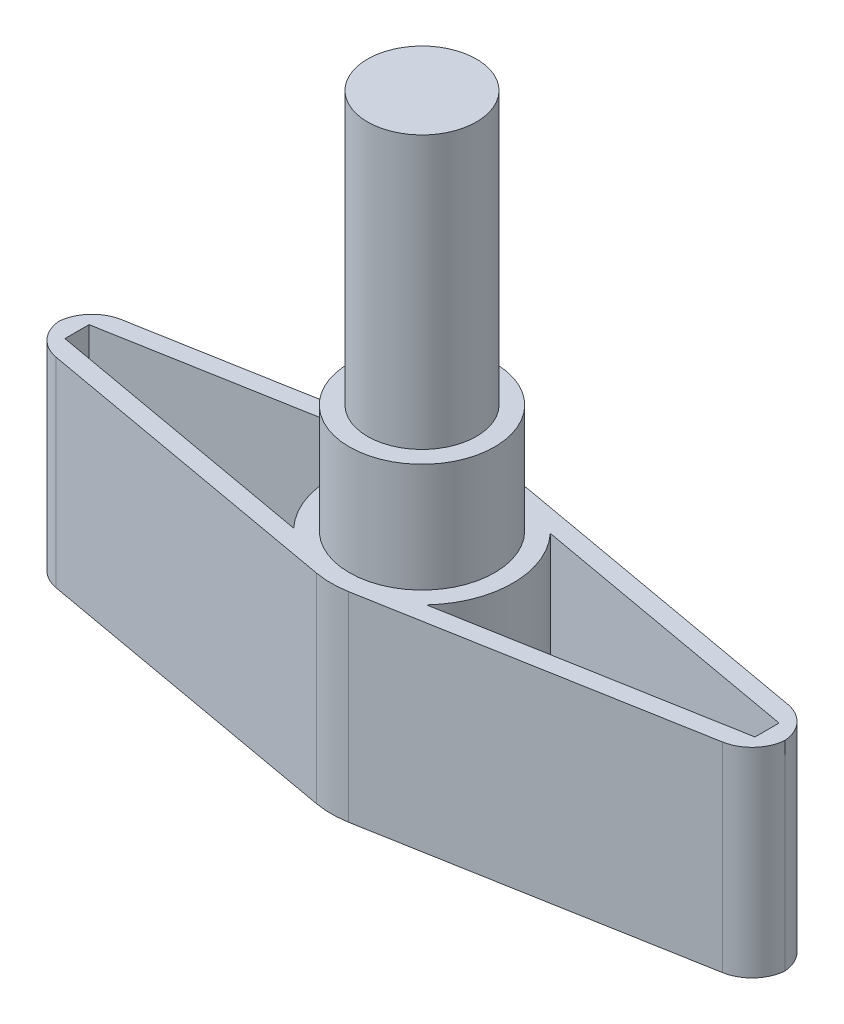
ISO-10303-21;
HEADER;
FILE_DESCRIPTION(('STEP AP214'),'2;1');
FILE_NAME('part.step','',(''),(''),'','','');
FILE_SCHEMA(('AUTOMOTIVE_DESIGN { 1 0 10303 214 1 1 1 1 }'));
ENDSEC;
DATA;
#1=APPLICATION_CONTEXT('core data for automotive mechanical design processes');
#2=APPLICATION_PROTOCOL_DEFINITION('international standard','automotive_design',2000,#1);
#3=PRODUCT_CONTEXT('',#1,'mechanical');
#4=PRODUCT('Part','Part','',(#3));
#5=PRODUCT_RELATED_PRODUCT_CATEGORY('part','',(#4));
#6=PRODUCT_DEFINITION_FORMATION('','',#4);
#7=PRODUCT_DEFINITION_CONTEXT('part definition',#1,'design');
#8=PRODUCT_DEFINITION('design','',#6,#7);
#9=PRODUCT_DEFINITION_SHAPE('','',#8);
#10=(LENGTH_UNIT() NAMED_UNIT(*) SI_UNIT(.MILLI.,.METRE.));
#11=(NAMED_UNIT(*) PLANE_ANGLE_UNIT() SI_UNIT($,.RADIAN.));
#12=(NAMED_UNIT(*) SI_UNIT($,.STERADIAN.) SOLID_ANGLE_UNIT());
#13=UNCERTAINTY_MEASURE_WITH_UNIT(LENGTH_MEASURE(1.E-05),#10,'distance_accuracy_value','');
#14=(GEOMETRIC_REPRESENTATION_CONTEXT(3) GLOBAL_UNCERTAINTY_ASSIGNED_CONTEXT((#13)) GLOBAL_UNIT_ASSIGNED_CONTEXT((#10,
#11,#12)) REPRESENTATION_CONTEXT('',''));
#15=CARTESIAN_POINT('',(0.,0.,0.));
#16=DIRECTION('',(0.,0.,1.));
#17=DIRECTION('',(1.,0.,0.));
#18=AXIS2_PLACEMENT_3D('',#15,#16,#17);
#19=CARTESIAN_POINT('',(0.,9.99999999999999,0.));
#20=DIRECTION('',(0.,1.,0.));
#21=DIRECTION('',(0.,0.,1.));
#22=AXIS2_PLACEMENT_3D('',#19,#20,#21);
#23=PLANE('',#22);
#24=CARTESIAN_POINT('',(0.,9.99999999999999,0.));
#25=DIRECTION('',(0.,1.,0.));
#26=DIRECTION('',(0.,0.,1.));
#27=AXIS2_PLACEMENT_3D('',#24,#25,#26);
#28=CIRCLE('',#27,4.);
#29=CARTESIAN_POINT('',(0.,9.99999999999999,4.));
#30=VERTEX_POINT('',#29);
#31=EDGE_CURVE('E322',#30,#30,#28,.T.);
#32=ORIENTED_EDGE('',*,*,#31,.F.);
#33=EDGE_LOOP('',(#32));
#34=FACE_BOUND('',#33,.T.);
#35=DIRECTION('',(0.984367303622125,0.,-0.176127827329209));
#36=VECTOR('',#35,1.);
#37=CARTESIAN_POINT('',(20.0001571937306,9.99999999999999,1.50087854583264));
#38=LINE('',#37,#36);
#39=CARTESIAN_POINT('',(0.880639136645989,9.99999999999999,4.92183651811062));
#40=VERTEX_POINT('',#39);
#41=CARTESIAN_POINT('',(18.3524128483891,10.,1.79570104803392));
#42=VERTEX_POINT('',#41);
#43=EDGE_CURVE('E283',#40,#42,#38,.T.);
#44=ORIENTED_EDGE('',*,*,#43,.T.);
#45=CARTESIAN_POINT('',(18.0001571937307,10.,-0.173033559210334));
#46=DIRECTION('',(0.,1.,0.));
#47=DIRECTION('',(0.,0.,1.));
#48=AXIS2_PLACEMENT_3D('',#45,#46,#47);
#49=CIRCLE('',#48,2.);
#50=CARTESIAN_POINT('',(19.9926579810295,10.,0.));
#51=VERTEX_POINT('',#50);
#52=EDGE_CURVE('E71',#42,#51,#49,.T.);
#53=ORIENTED_EDGE('',*,*,#52,.T.);
#54=CARTESIAN_POINT('',(18.0001571937306,10.,0.173033559210334));
#55=DIRECTION('',(0.,1.,0.));
#56=DIRECTION('',(0.,0.,1.));
#57=AXIS2_PLACEMENT_3D('',#54,#55,#56);
#58=CIRCLE('',#57,2.);
#59=CARTESIAN_POINT('',(18.3524128483891,10.,-1.79570104803389));
#60=VERTEX_POINT('',#59);
#61=EDGE_CURVE('E310',#51,#60,#58,.T.);
#62=ORIENTED_EDGE('',*,*,#61,.T.);
#63=DIRECTION('',(-0.984367303622125,0.,-0.17612782732921));
#64=VECTOR('',#63,1.);
#65=CARTESIAN_POINT('',(20.0001571937306,10.,-1.50087854583264));
#66=LINE('',#65,#64);
#67=CARTESIAN_POINT('',(0.880639136646044,9.99999999999999,-4.92183651811062));
#68=VERTEX_POINT('',#67);
#69=EDGE_CURVE('E285',#60,#68,#66,.T.);
#70=ORIENTED_EDGE('',*,*,#69,.T.);
#71=CARTESIAN_POINT('',(0.,9.99999999999999,0.));
#72=DIRECTION('',(0.,1.,0.));
#73=DIRECTION('',(0.,0.,1.));
#74=AXIS2_PLACEMENT_3D('',#71,#72,#73);
#75=CIRCLE('',#74,5.);
#76=CARTESIAN_POINT('',(-0.880639136646044,10.,-4.92183651811062));
#77=VERTEX_POINT('',#76);
#78=EDGE_CURVE('E287',#68,#77,#75,.T.);
#79=ORIENTED_EDGE('',*,*,#78,.T.);
#80=DIRECTION('',(-0.984367303622125,0.,0.17612782732921));
#81=VECTOR('',#80,1.);
#82=CARTESIAN_POINT('',(-20.0001571937307,10.,-1.50087854583261));
#83=LINE('',#82,#81);
#84=CARTESIAN_POINT('',(-18.3524128483891,9.99999999999999,-1.79570104803389));
#85=VERTEX_POINT('',#84);
#86=EDGE_CURVE('E197',#77,#85,#83,.T.);
#87=ORIENTED_EDGE('',*,*,#86,.T.);
#88=CARTESIAN_POINT('',(-18.0001571937307,10.,0.173033559210362));
#89=DIRECTION('',(0.,1.,0.));
#90=DIRECTION('',(0.,0.,1.));
#91=AXIS2_PLACEMENT_3D('',#88,#89,#90);
#92=CIRCLE('',#91,2.);
#93=CARTESIAN_POINT('',(-19.9926579810296,10.,0.));
#94=VERTEX_POINT('',#93);
#95=EDGE_CURVE('E78',#85,#94,#92,.T.);
#96=ORIENTED_EDGE('',*,*,#95,.T.);
#97=CARTESIAN_POINT('',(-18.0001571937307,9.99999999999999,-0.173033559210334));
#98=DIRECTION('',(0.,1.,0.));
#99=DIRECTION('',(0.,0.,1.));
#100=AXIS2_PLACEMENT_3D('',#97,#98,#99);
#101=CIRCLE('',#100,2.);
#102=CARTESIAN_POINT('',(-18.3524128483891,9.99999999999999,1.79570104803389));
#103=VERTEX_POINT('',#102);
#104=EDGE_CURVE('E307',#94,#103,#101,.T.);
#105=ORIENTED_EDGE('',*,*,#104,.T.);
#106=DIRECTION('',(0.984367303622125,0.,0.176127827329209));
#107=VECTOR('',#106,1.);
#108=CARTESIAN_POINT('',(-20.0001571937307,10.,1.50087854583264));
#109=LINE('',#108,#107);
#110=CARTESIAN_POINT('',(-0.8806391366461,9.99999999999999,4.92183651811062));
#111=VERTEX_POINT('',#110);
#112=EDGE_CURVE('E279',#103,#111,#109,.T.);
#113=ORIENTED_EDGE('',*,*,#112,.T.);
#114=CARTESIAN_POINT('',(0.,9.99999999999999,0.));
#115=DIRECTION('',(0.,1.,0.));
#116=DIRECTION('',(0.,0.,1.));
#117=AXIS2_PLACEMENT_3D('',#114,#115,#116);
#118=CIRCLE('',#117,5.);
#119=EDGE_CURVE('E281',#111,#40,#118,.T.);
#120=ORIENTED_EDGE('',*,*,#119,.T.);
#121=EDGE_LOOP('',(#44,#53,#62,#70,#79,#87,#96,#105,#113,#120));
#122=FACE_BOUND('',#121,.T.);
#123=CARTESIAN_POINT('',(0.,9.99999999999999,0.));
#124=DIRECTION('',(0.,-1.,0.));
#125=DIRECTION('',(0.,0.,1.));
#126=AXIS2_PLACEMENT_3D('',#123,#124,#125);
#127=CIRCLE('',#126,4.99999999999997);
#128=CARTESIAN_POINT('',(-3.65761322018321,10.,3.40908573250082));
#129=VERTEX_POINT('',#128);
#130=CARTESIAN_POINT('',(-3.65761322018321,10.,-3.40908573250087));
#131=VERTEX_POINT('',#130);
#132=EDGE_CURVE('E251',#129,#131,#127,.T.);
#133=ORIENTED_EDGE('',*,*,#132,.F.);
#134=DIRECTION('',(0.984367303622126,0.,0.176127827329204));
#135=VECTOR('',#134,1.);
#136=CARTESIAN_POINT('',(-18.8240293664014,9.99999999999999,0.695436148270612));
#137=LINE('',#136,#135);
#138=CARTESIAN_POINT('',(-19.0001571937305,9.99999999999998,0.663922493311153));
#139=VERTEX_POINT('',#138);
#140=EDGE_CURVE('E249',#139,#129,#137,.T.);
#141=ORIENTED_EDGE('',*,*,#140,.F.);
#142=DIRECTION('',(0.,0.,1.));
#143=VECTOR('',#142,1.);
#144=CARTESIAN_POINT('',(-19.0001571937305,9.99999999999998,0.663922493311153));
#145=LINE('',#144,#143);
#146=CARTESIAN_POINT('',(-19.0001571937307,10.,-0.663922493311125));
#147=VERTEX_POINT('',#146);
#148=EDGE_CURVE('E257',#147,#139,#145,.T.);
#149=ORIENTED_EDGE('',*,*,#148,.F.);
#150=DIRECTION('',(-0.984367303622125,0.,0.17612782732921));
#151=VECTOR('',#150,1.);
#152=CARTESIAN_POINT('',(-18.8240293664014,9.99999999999999,-0.695436148270584));
#153=LINE('',#152,#151);
#154=EDGE_CURVE('E254',#131,#147,#153,.T.);
#155=ORIENTED_EDGE('',*,*,#154,.F.);
#156=EDGE_LOOP('',(#133,#141,#149,#155));
#157=FACE_BOUND('',#156,.T.);
#158=DIRECTION('',(0.984367303622125,0.,-0.176127827329206));
#159=VECTOR('',#158,1.);
#160=CARTESIAN_POINT('',(18.8240293664014,10.,0.695436148270584));
#161=LINE('',#160,#159);
#162=CARTESIAN_POINT('',(3.65761322018321,10.,3.40908573250082));
#163=VERTEX_POINT('',#162);
#164=CARTESIAN_POINT('',(19.0001571937306,10.,0.663922493311153));
#165=VERTEX_POINT('',#164);
#166=EDGE_CURVE('E223',#163,#165,#161,.T.);
#167=ORIENTED_EDGE('',*,*,#166,.F.);
#168=CARTESIAN_POINT('',(0.,9.99999999999999,0.));
#169=DIRECTION('',(0.,-1.,0.));
#170=DIRECTION('',(0.,0.,1.));
#171=AXIS2_PLACEMENT_3D('',#168,#169,#170);
#172=CIRCLE('',#171,4.99999999999997);
#173=CARTESIAN_POINT('',(3.65761322018321,10.,-3.40908573250084));
#174=VERTEX_POINT('',#173);
#175=EDGE_CURVE('E220',#174,#163,#172,.T.);
#176=ORIENTED_EDGE('',*,*,#175,.F.);
#177=DIRECTION('',(-0.984367303622125,0.,-0.17612782732921));
#178=VECTOR('',#177,1.);
#179=CARTESIAN_POINT('',(18.8240293664013,10.,-0.695436148270612));
#180=LINE('',#179,#178);
#181=CARTESIAN_POINT('',(19.0001571937307,10.,-0.663922493311153));
#182=VERTEX_POINT('',#181);
#183=EDGE_CURVE('E218',#182,#174,#180,.T.);
#184=ORIENTED_EDGE('',*,*,#183,.F.);
#185=DIRECTION('',(0.,0.,-1.));
#186=VECTOR('',#185,1.);
#187=CARTESIAN_POINT('',(19.0001571937306,10.,0.663922493311153));
#188=LINE('',#187,#186);
#189=EDGE_CURVE('E225',#165,#182,#188,.T.);
#190=ORIENTED_EDGE('',*,*,#189,.F.);
#191=EDGE_LOOP('',(#167,#176,#184,#190));
#192=FACE_BOUND('',#191,.T.);
#193=ADVANCED_FACE('F54',(#34,#122,#157,#192),#23,.T.);
#194=CARTESIAN_POINT('',(-20.0001571937307,10.,1.50087854583264));
#195=DIRECTION('',(0.176127827329209,0.,-0.984367303622125));
#196=DIRECTION('',(-0.984367303622125,0.,-0.176127827329209));
#197=AXIS2_PLACEMENT_3D('',#194,#195,#196);
#198=PLANE('',#197);
#199=ORIENTED_EDGE('',*,*,#112,.F.);
#200=DIRECTION('',(0.,-1.,0.));
#201=VECTOR('',#200,1.);
#202=CARTESIAN_POINT('',(-18.3524128483891,9.99999999999999,1.79570104803389));
#203=LINE('',#202,#201);
#204=CARTESIAN_POINT('',(-18.3524128483891,-0.999999999999997,1.79570104803392));
#205=VERTEX_POINT('',#204);
#206=EDGE_CURVE('E13',#103,#205,#203,.T.);
#207=ORIENTED_EDGE('',*,*,#206,.T.);
#208=DIRECTION('',(-0.984367303622125,0.,-0.176127827329209));
#209=VECTOR('',#208,1.);
#210=CARTESIAN_POINT('',(-20.0001571937307,-0.999999999999997,1.50087854583264));
#211=LINE('',#210,#209);
#212=CARTESIAN_POINT('',(-0.880639136646044,-1.,4.92183651811062));
#213=VERTEX_POINT('',#212);
#214=EDGE_CURVE('E214',#213,#205,#211,.T.);
#215=ORIENTED_EDGE('',*,*,#214,.F.);
#216=DIRECTION('',(0.,-1.,0.));
#217=VECTOR('',#216,1.);
#218=CARTESIAN_POINT('',(-0.8806391366461,9.99999999999999,4.92183651811062));
#219=LINE('',#218,#217);
#220=EDGE_CURVE('E294',#111,#213,#219,.T.);
#221=ORIENTED_EDGE('',*,*,#220,.F.);
#222=EDGE_LOOP('',(#199,#207,#215,#221));
#223=FACE_BOUND('',#222,.T.);
#224=ADVANCED_FACE('F336',(#223),#198,.F.);
#225=CARTESIAN_POINT('',(0.,9.99999999999999,0.));
#226=DIRECTION('',(0.,-1.,0.));
#227=DIRECTION('',(0.,0.,-1.));
#228=AXIS2_PLACEMENT_3D('',#225,#226,#227);
#229=CYLINDRICAL_SURFACE('',#228,5.);
#230=ORIENTED_EDGE('',*,*,#220,.T.);
#231=CARTESIAN_POINT('',(0.,-0.999999999999997,0.));
#232=DIRECTION('',(0.,-1.,0.));
#233=DIRECTION('',(0.,0.,-1.));
#234=AXIS2_PLACEMENT_3D('',#231,#232,#233);
#235=CIRCLE('',#234,5.);
#236=CARTESIAN_POINT('',(0.880639136645989,-0.999999999999997,4.92183651811062));
#237=VERTEX_POINT('',#236);
#238=EDGE_CURVE('E211',#237,#213,#235,.T.);
#239=ORIENTED_EDGE('',*,*,#238,.F.);
#240=DIRECTION('',(0.,-1.,0.));
#241=VECTOR('',#240,1.);
#242=CARTESIAN_POINT('',(0.880639136645989,9.99999999999999,4.92183651811062));
#243=LINE('',#242,#241);
#244=EDGE_CURVE('E291',#40,#237,#243,.T.);
#245=ORIENTED_EDGE('',*,*,#244,.F.);
#246=ORIENTED_EDGE('',*,*,#119,.F.);
#247=EDGE_LOOP('',(#230,#239,#245,#246));
#248=FACE_BOUND('',#247,.T.);
#249=ADVANCED_FACE('F340',(#248),#229,.T.);
#250=CARTESIAN_POINT('',(20.0001571937306,9.99999999999999,1.50087854583264));
#251=DIRECTION('',(-0.176127827329209,0.,-0.984367303622124));
#252=DIRECTION('',(-0.984367303622125,0.,0.176127827329209));
#253=AXIS2_PLACEMENT_3D('',#250,#251,#252);
#254=PLANE('',#253);
#255=DIRECTION('',(-0.984367303622125,0.,0.176127827329209));
#256=VECTOR('',#255,1.);
#257=CARTESIAN_POINT('',(20.0001571937306,-1.,1.50087854583264));
#258=LINE('',#257,#256);
#259=CARTESIAN_POINT('',(18.3524128483891,-1.,1.79570104803392));
#260=VERTEX_POINT('',#259);
#261=EDGE_CURVE('E206',#260,#237,#258,.T.);
#262=ORIENTED_EDGE('',*,*,#261,.F.);
#263=DIRECTION('',(0.,-1.,0.));
#264=VECTOR('',#263,1.);
#265=CARTESIAN_POINT('',(18.3524128483891,10.,1.79570104803392));
#266=LINE('',#265,#264);
#267=EDGE_CURVE('E304',#260,#42,#266,.F.);
#268=ORIENTED_EDGE('',*,*,#267,.T.);
#269=ORIENTED_EDGE('',*,*,#43,.F.);
#270=ORIENTED_EDGE('',*,*,#244,.T.);
#271=EDGE_LOOP('',(#262,#268,#269,#270));
#272=FACE_BOUND('',#271,.T.);
#273=ADVANCED_FACE('F346',(#272),#254,.F.);
#274=CARTESIAN_POINT('',(20.0001571937306,10.,-1.50087854583264));
#275=DIRECTION('',(-0.17612782732921,0.,0.984367303622124));
#276=DIRECTION('',(0.984367303622125,0.,0.17612782732921));
#277=AXIS2_PLACEMENT_3D('',#274,#275,#276);
#278=PLANE('',#277);
#279=ORIENTED_EDGE('',*,*,#69,.F.);
#280=DIRECTION('',(0.,-1.,0.));
#281=VECTOR('',#280,1.);
#282=CARTESIAN_POINT('',(18.3524128483891,10.,-1.79570104803389));
#283=LINE('',#282,#281);
#284=CARTESIAN_POINT('',(18.352412848389,-1.,-1.79570104803392));
#285=VERTEX_POINT('',#284);
#286=EDGE_CURVE('E313',#60,#285,#283,.T.);
#287=ORIENTED_EDGE('',*,*,#286,.T.);
#288=DIRECTION('',(0.984367303622125,0.,0.17612782732921));
#289=VECTOR('',#288,1.);
#290=CARTESIAN_POINT('',(0.880639136646044,-1.,-4.92183651811062));
#291=LINE('',#290,#289);
#292=CARTESIAN_POINT('',(0.880639136646044,-1.,-4.92183651811062));
#293=VERTEX_POINT('',#292);
#294=EDGE_CURVE('E204',#293,#285,#291,.T.);
#295=ORIENTED_EDGE('',*,*,#294,.F.);
#296=DIRECTION('',(0.,-1.,0.));
#297=VECTOR('',#296,1.);
#298=CARTESIAN_POINT('',(0.880639136646044,9.99999999999999,-4.92183651811062));
#299=LINE('',#298,#297);
#300=EDGE_CURVE('E200',#68,#293,#299,.T.);
#301=ORIENTED_EDGE('',*,*,#300,.F.);
#302=EDGE_LOOP('',(#279,#287,#295,#301));
#303=FACE_BOUND('',#302,.T.);
#304=ADVANCED_FACE('F374',(#303),#278,.F.);
#305=CARTESIAN_POINT('',(0.,9.99999999999999,0.));
#306=DIRECTION('',(0.,-1.,0.));
#307=DIRECTION('',(0.,0.,-1.));
#308=AXIS2_PLACEMENT_3D('',#305,#306,#307);
#309=CYLINDRICAL_SURFACE('',#308,5.);
#310=ORIENTED_EDGE('',*,*,#300,.T.);
#311=CARTESIAN_POINT('',(0.,-0.999999999999997,0.));
#312=DIRECTION('',(0.,-1.,0.));
#313=DIRECTION('',(0.,0.,-1.));
#314=AXIS2_PLACEMENT_3D('',#311,#312,#313);
#315=CIRCLE('',#314,5.);
#316=CARTESIAN_POINT('',(-0.880639136646044,-1.,-4.92183651811062));
#317=VERTEX_POINT('',#316);
#318=EDGE_CURVE('E184',#317,#293,#315,.T.);
#319=ORIENTED_EDGE('',*,*,#318,.F.);
#320=DIRECTION('',(0.,-1.,0.));
#321=VECTOR('',#320,1.);
#322=CARTESIAN_POINT('',(-0.880639136646044,10.,-4.92183651811062));
#323=LINE('',#322,#321);
#324=EDGE_CURVE('E195',#77,#317,#323,.T.);
#325=ORIENTED_EDGE('',*,*,#324,.F.);
#326=ORIENTED_EDGE('',*,*,#78,.F.);
#327=EDGE_LOOP('',(#310,#319,#325,#326));
#328=FACE_BOUND('',#327,.T.);
#329=ADVANCED_FACE('F202',(#328),#309,.T.);
#330=CARTESIAN_POINT('',(-20.0001571937307,10.,-1.50087854583261));
#331=DIRECTION('',(0.17612782732921,0.,0.984367303622124));
#332=DIRECTION('',(0.984367303622125,0.,-0.17612782732921));
#333=AXIS2_PLACEMENT_3D('',#330,#331,#332);
#334=PLANE('',#333);
#335=DIRECTION('',(0.984367303622125,0.,-0.17612782732921));
#336=VECTOR('',#335,1.);
#337=CARTESIAN_POINT('',(-20.0001571937306,-0.999999999999997,-1.50087854583264));
#338=LINE('',#337,#336);
#339=CARTESIAN_POINT('',(-18.3524128483892,-1.,-1.79570104803389));
#340=VERTEX_POINT('',#339);
#341=EDGE_CURVE('E179',#340,#317,#338,.T.);
#342=ORIENTED_EDGE('',*,*,#341,.F.);
#343=DIRECTION('',(0.,-1.,0.));
#344=VECTOR('',#343,1.);
#345=CARTESIAN_POINT('',(-18.3524128483891,9.99999999999999,-1.79570104803389));
#346=LINE('',#345,#344);
#347=EDGE_CURVE('E63',#340,#85,#346,.F.);
#348=ORIENTED_EDGE('',*,*,#347,.T.);
#349=ORIENTED_EDGE('',*,*,#86,.F.);
#350=ORIENTED_EDGE('',*,*,#324,.T.);
#351=EDGE_LOOP('',(#342,#348,#349,#350));
#352=FACE_BOUND('',#351,.T.);
#353=ADVANCED_FACE('F196',(#352),#334,.F.);
#354=CARTESIAN_POINT('',(-18.8240293664014,9.99999999999999,0.695436148270612));
#355=DIRECTION('',(0.176127827329206,0.,-0.984367303622125));
#356=DIRECTION('',(-0.984367303622125,0.,-0.176127827329206));
#357=AXIS2_PLACEMENT_3D('',#354,#355,#356);
#358=PLANE('',#357);
#359=DIRECTION('',(0.984367303622125,0.,0.176127827329205));
#360=VECTOR('',#359,1.);
#361=CARTESIAN_POINT('',(-18.8240293664013,0.,0.695436148270584));
#362=LINE('',#361,#360);
#363=CARTESIAN_POINT('',(-19.0001571937306,0.,0.663922493311153));
#364=VERTEX_POINT('',#363);
#365=CARTESIAN_POINT('',(-3.65761322018326,0.,3.40908573250082));
#366=VERTEX_POINT('',#365);
#367=EDGE_CURVE('E248',#364,#366,#362,.T.);
#368=ORIENTED_EDGE('',*,*,#367,.F.);
#369=DIRECTION('',(0.,-1.,0.));
#370=VECTOR('',#369,1.);
#371=CARTESIAN_POINT('',(-19.0001571937305,9.99999999999998,0.663922493311153));
#372=LINE('',#371,#370);
#373=EDGE_CURVE('E259',#139,#364,#372,.T.);
#374=ORIENTED_EDGE('',*,*,#373,.F.);
#375=ORIENTED_EDGE('',*,*,#140,.T.);
#376=DIRECTION('',(0.,-1.,0.));
#377=VECTOR('',#376,1.);
#378=CARTESIAN_POINT('',(-3.65761322018321,10.,3.40908573250082));
#379=LINE('',#378,#377);
#380=EDGE_CURVE('E277',#129,#366,#379,.T.);
#381=ORIENTED_EDGE('',*,*,#380,.T.);
#382=EDGE_LOOP('',(#368,#374,#375,#381));
#383=FACE_BOUND('',#382,.T.);
#384=ADVANCED_FACE('F368',(#383),#358,.T.);
#385=CARTESIAN_POINT('',(0.,9.99999999999999,0.));
#386=DIRECTION('',(0.,-1.,0.));
#387=DIRECTION('',(0.,0.,-1.));
#388=AXIS2_PLACEMENT_3D('',#385,#386,#387);
#389=CYLINDRICAL_SURFACE('',#388,4.99999999999997);
#390=CARTESIAN_POINT('',(0.,0.,0.));
#391=DIRECTION('',(0.,-1.,0.));
#392=DIRECTION('',(0.,0.,1.));
#393=AXIS2_PLACEMENT_3D('',#390,#391,#392);
#394=CIRCLE('',#393,4.99999999999997);
#395=CARTESIAN_POINT('',(-3.65761322018321,0.,-3.40908573250087));
#396=VERTEX_POINT('',#395);
#397=EDGE_CURVE('E262',#366,#396,#394,.T.);
#398=ORIENTED_EDGE('',*,*,#397,.F.);
#399=ORIENTED_EDGE('',*,*,#380,.F.);
#400=ORIENTED_EDGE('',*,*,#132,.T.);
#401=DIRECTION('',(0.,-1.,0.));
#402=VECTOR('',#401,1.);
#403=CARTESIAN_POINT('',(-3.65761322018321,10.,-3.40908573250087));
#404=LINE('',#403,#402);
#405=EDGE_CURVE('E274',#131,#396,#404,.T.);
#406=ORIENTED_EDGE('',*,*,#405,.T.);
#407=EDGE_LOOP('',(#398,#399,#400,#406));
#408=FACE_BOUND('',#407,.T.);
#409=ADVANCED_FACE('F407',(#408),#389,.T.);
#410=CARTESIAN_POINT('',(-18.8240293664014,9.99999999999999,-0.695436148270584));
#411=DIRECTION('',(0.176127827329209,0.,0.984367303622125));
#412=DIRECTION('',(0.984367303622125,0.,-0.176127827329209));
#413=AXIS2_PLACEMENT_3D('',#410,#411,#412);
#414=PLANE('',#413);
#415=DIRECTION('',(-0.984367303622125,0.,0.176127827329209));
#416=VECTOR('',#415,1.);
#417=CARTESIAN_POINT('',(-18.8240293664014,0.,-0.695436148270612));
#418=LINE('',#417,#416);
#419=CARTESIAN_POINT('',(-19.0001571937307,0.,-0.663922493311153));
#420=VERTEX_POINT('',#419);
#421=EDGE_CURVE('E265',#396,#420,#418,.T.);
#422=ORIENTED_EDGE('',*,*,#421,.F.);
#423=ORIENTED_EDGE('',*,*,#405,.F.);
#424=ORIENTED_EDGE('',*,*,#154,.T.);
#425=DIRECTION('',(0.,-1.,0.));
#426=VECTOR('',#425,1.);
#427=CARTESIAN_POINT('',(-19.0001571937307,10.,-0.663922493311125));
#428=LINE('',#427,#426);
#429=EDGE_CURVE('E272',#147,#420,#428,.T.);
#430=ORIENTED_EDGE('',*,*,#429,.T.);
#431=EDGE_LOOP('',(#422,#423,#424,#430));
#432=FACE_BOUND('',#431,.T.);
#433=ADVANCED_FACE('F414',(#432),#414,.T.);
#434=CARTESIAN_POINT('',(-19.0001571937305,9.99999999999998,0.663922493311153));
#435=DIRECTION('',(1.,0.,0.));
#436=DIRECTION('',(0.,0.,-1.));
#437=AXIS2_PLACEMENT_3D('',#434,#435,#436);
#438=PLANE('',#437);
#439=DIRECTION('',(0.,0.,1.));
#440=VECTOR('',#439,1.);
#441=CARTESIAN_POINT('',(-19.0001571937306,0.,0.663922493311153));
#442=LINE('',#441,#440);
#443=EDGE_CURVE('E252',#420,#364,#442,.T.);
#444=ORIENTED_EDGE('',*,*,#443,.F.);
#445=ORIENTED_EDGE('',*,*,#429,.F.);
#446=ORIENTED_EDGE('',*,*,#148,.T.);
#447=ORIENTED_EDGE('',*,*,#373,.T.);
#448=EDGE_LOOP('',(#444,#445,#446,#447));
#449=FACE_BOUND('',#448,.T.);
#450=ADVANCED_FACE('F421',(#449),#438,.T.);
#451=CARTESIAN_POINT('',(0.,9.99999999999999,0.));
#452=DIRECTION('',(0.,-1.,0.));
#453=DIRECTION('',(0.,0.,-1.));
#454=AXIS2_PLACEMENT_3D('',#451,#452,#453);
#455=CYLINDRICAL_SURFACE('',#454,4.99999999999997);
#456=CARTESIAN_POINT('',(0.,0.,0.));
#457=DIRECTION('',(0.,-1.,0.));
#458=DIRECTION('',(0.,0.,1.));
#459=AXIS2_PLACEMENT_3D('',#456,#457,#458);
#460=CIRCLE('',#459,4.99999999999997);
#461=CARTESIAN_POINT('',(3.65761322018315,0.,-3.40908573250087));
#462=VERTEX_POINT('',#461);
#463=CARTESIAN_POINT('',(3.65761322018321,0.,3.40908573250082));
#464=VERTEX_POINT('',#463);
#465=EDGE_CURVE('E217',#462,#464,#460,.T.);
#466=ORIENTED_EDGE('',*,*,#465,.F.);
#467=DIRECTION('',(0.,-1.,0.));
#468=VECTOR('',#467,1.);
#469=CARTESIAN_POINT('',(3.65761322018321,10.,-3.40908573250084));
#470=LINE('',#469,#468);
#471=EDGE_CURVE('E245',#174,#462,#470,.T.);
#472=ORIENTED_EDGE('',*,*,#471,.F.);
#473=ORIENTED_EDGE('',*,*,#175,.T.);
#474=DIRECTION('',(0.,-1.,0.));
#475=VECTOR('',#474,1.);
#476=CARTESIAN_POINT('',(3.65761322018321,10.,3.40908573250082));
#477=LINE('',#476,#475);
#478=EDGE_CURVE('E242',#163,#464,#477,.T.);
#479=ORIENTED_EDGE('',*,*,#478,.T.);
#480=EDGE_LOOP('',(#466,#472,#473,#479));
#481=FACE_BOUND('',#480,.T.);
#482=ADVANCED_FACE('F429',(#481),#455,.T.);
#483=CARTESIAN_POINT('',(18.8240293664014,10.,0.695436148270584));
#484=DIRECTION('',(-0.176127827329204,0.,-0.984367303622125));
#485=DIRECTION('',(-0.984367303622126,0.,0.176127827329204));
#486=AXIS2_PLACEMENT_3D('',#483,#484,#485);
#487=PLANE('',#486);
#488=DIRECTION('',(0.984367303622126,0.,-0.176127827329204));
#489=VECTOR('',#488,1.);
#490=CARTESIAN_POINT('',(18.8240293664014,0.,0.695436148270612));
#491=LINE('',#490,#489);
#492=CARTESIAN_POINT('',(19.0001571937306,0.,0.663922493311153));
#493=VERTEX_POINT('',#492);
#494=EDGE_CURVE('E231',#464,#493,#491,.T.);
#495=ORIENTED_EDGE('',*,*,#494,.F.);
#496=ORIENTED_EDGE('',*,*,#478,.F.);
#497=ORIENTED_EDGE('',*,*,#166,.T.);
#498=DIRECTION('',(0.,-1.,0.));
#499=VECTOR('',#498,1.);
#500=CARTESIAN_POINT('',(19.0001571937306,10.,0.663922493311153));
#501=LINE('',#500,#499);
#502=EDGE_CURVE('E240',#165,#493,#501,.T.);
#503=ORIENTED_EDGE('',*,*,#502,.T.);
#504=EDGE_LOOP('',(#495,#496,#497,#503));
#505=FACE_BOUND('',#504,.T.);
#506=ADVANCED_FACE('F437',(#505),#487,.T.);
#507=CARTESIAN_POINT('',(19.0001571937306,10.,0.663922493311153));
#508=DIRECTION('',(-1.,0.,0.));
#509=DIRECTION('',(0.,0.,1.));
#510=AXIS2_PLACEMENT_3D('',#507,#508,#509);
#511=PLANE('',#510);
#512=DIRECTION('',(0.,0.,-1.));
#513=VECTOR('',#512,1.);
#514=CARTESIAN_POINT('',(19.0001571937306,0.,0.663922493311153));
#515=LINE('',#514,#513);
#516=CARTESIAN_POINT('',(19.0001571937305,0.,-0.663922493311153));
#517=VERTEX_POINT('',#516);
#518=EDGE_CURVE('E234',#493,#517,#515,.T.);
#519=ORIENTED_EDGE('',*,*,#518,.F.);
#520=ORIENTED_EDGE('',*,*,#502,.F.);
#521=ORIENTED_EDGE('',*,*,#189,.T.);
#522=DIRECTION('',(0.,-1.,0.));
#523=VECTOR('',#522,1.);
#524=CARTESIAN_POINT('',(19.0001571937307,10.,-0.663922493311153));
#525=LINE('',#524,#523);
#526=EDGE_CURVE('E228',#182,#517,#525,.T.);
#527=ORIENTED_EDGE('',*,*,#526,.T.);
#528=EDGE_LOOP('',(#519,#520,#521,#527));
#529=FACE_BOUND('',#528,.T.);
#530=ADVANCED_FACE('F445',(#529),#511,.T.);
#531=CARTESIAN_POINT('',(18.8240293664013,10.,-0.695436148270612));
#532=DIRECTION('',(-0.176127827329209,0.,0.984367303622124));
#533=DIRECTION('',(0.984367303622125,0.,0.176127827329209));
#534=AXIS2_PLACEMENT_3D('',#531,#532,#533);
#535=PLANE('',#534);
#536=DIRECTION('',(-0.984367303622125,0.,-0.176127827329209));
#537=VECTOR('',#536,1.);
#538=CARTESIAN_POINT('',(18.8240293664014,0.,-0.695436148270584));
#539=LINE('',#538,#537);
#540=EDGE_CURVE('E221',#517,#462,#539,.T.);
#541=ORIENTED_EDGE('',*,*,#540,.F.);
#542=ORIENTED_EDGE('',*,*,#526,.F.);
#543=ORIENTED_EDGE('',*,*,#183,.T.);
#544=ORIENTED_EDGE('',*,*,#471,.T.);
#545=EDGE_LOOP('',(#541,#542,#543,#544));
#546=FACE_BOUND('',#545,.T.);
#547=ADVANCED_FACE('F453',(#546),#535,.T.);
#548=CARTESIAN_POINT('',(0.,0.,0.));
#549=DIRECTION('',(0.,-1.,0.));
#550=DIRECTION('',(0.,0.,-1.));
#551=AXIS2_PLACEMENT_3D('',#548,#549,#550);
#552=PLANE('',#551);
#553=ORIENTED_EDGE('',*,*,#540,.T.);
#554=ORIENTED_EDGE('',*,*,#465,.T.);
#555=ORIENTED_EDGE('',*,*,#494,.T.);
#556=ORIENTED_EDGE('',*,*,#518,.T.);
#557=EDGE_LOOP('',(#553,#554,#555,#556));
#558=FACE_BOUND('',#557,.T.);
#559=ADVANCED_FACE('F461',(#558),#552,.F.);
#560=ORIENTED_EDGE('',*,*,#443,.T.);
#561=ORIENTED_EDGE('',*,*,#367,.T.);
#562=ORIENTED_EDGE('',*,*,#397,.T.);
#563=ORIENTED_EDGE('',*,*,#421,.T.);
#564=EDGE_LOOP('',(#560,#561,#562,#563));
#565=FACE_BOUND('',#564,.T.);
#566=ADVANCED_FACE('F469',(#565),#552,.F.);
#567=CARTESIAN_POINT('',(0.,-0.999999999999997,0.));
#568=DIRECTION('',(0.,-1.,0.));
#569=DIRECTION('',(0.,0.,-1.));
#570=AXIS2_PLACEMENT_3D('',#567,#568,#569);
#571=PLANE('',#570);
#572=CARTESIAN_POINT('',(18.0001571937307,-0.999999999999997,0.173033559210334));
#573=DIRECTION('',(0.,-1.,0.));
#574=DIRECTION('',(0.,0.,-1.));
#575=AXIS2_PLACEMENT_3D('',#572,#573,#574);
#576=CIRCLE('',#575,2.);
#577=CARTESIAN_POINT('',(19.9926579810296,-0.999999999999984,0.));
#578=VERTEX_POINT('',#577);
#579=EDGE_CURVE('E300',#285,#578,#576,.T.);
#580=ORIENTED_EDGE('',*,*,#579,.T.);
#581=CARTESIAN_POINT('',(18.0001571937306,-1.,-0.173033559210334));
#582=DIRECTION('',(0.,-1.,0.));
#583=DIRECTION('',(0.,0.,-1.));
#584=AXIS2_PLACEMENT_3D('',#581,#582,#583);
#585=CIRCLE('',#584,2.);
#586=EDGE_CURVE('E302',#578,#260,#585,.T.);
#587=ORIENTED_EDGE('',*,*,#586,.T.);
#588=ORIENTED_EDGE('',*,*,#261,.T.);
#589=ORIENTED_EDGE('',*,*,#238,.T.);
#590=ORIENTED_EDGE('',*,*,#214,.T.);
#591=CARTESIAN_POINT('',(-18.0001571937307,-1.,-0.173033559210334));
#592=DIRECTION('',(0.,-1.,0.));
#593=DIRECTION('',(0.,0.,-1.));
#594=AXIS2_PLACEMENT_3D('',#591,#592,#593);
#595=CIRCLE('',#594,2.);
#596=CARTESIAN_POINT('',(-19.9926579810296,-0.99999999999998,0.));
#597=VERTEX_POINT('',#596);
#598=EDGE_CURVE('E297',#205,#597,#595,.T.);
#599=ORIENTED_EDGE('',*,*,#598,.T.);
#600=CARTESIAN_POINT('',(-18.0001571937307,-0.999999999999997,0.173033559210334));
#601=DIRECTION('',(0.,-1.,0.));
#602=DIRECTION('',(0.,0.,-1.));
#603=AXIS2_PLACEMENT_3D('',#600,#601,#602);
#604=CIRCLE('',#603,2.);
#605=EDGE_CURVE('E187',#597,#340,#604,.T.);
#606=ORIENTED_EDGE('',*,*,#605,.T.);
#607=ORIENTED_EDGE('',*,*,#341,.T.);
#608=ORIENTED_EDGE('',*,*,#318,.T.);
#609=ORIENTED_EDGE('',*,*,#294,.T.);
#610=EDGE_LOOP('',(#580,#587,#588,#589,#590,#599,#606,#607,#608,#609));
#611=FACE_BOUND('',#610,.T.);
#612=ADVANCED_FACE('F181',(#611),#571,.T.);
#613=CARTESIAN_POINT('',(0.,16.,0.));
#614=DIRECTION('',(0.,-1.,0.));
#615=DIRECTION('',(0.,0.,-1.));
#616=AXIS2_PLACEMENT_3D('',#613,#614,#615);
#617=CYLINDRICAL_SURFACE('',#616,4.);
#618=CARTESIAN_POINT('',(0.,16.,0.));
#619=DIRECTION('',(0.,1.,0.));
#620=DIRECTION('',(0.,0.,1.));
#621=AXIS2_PLACEMENT_3D('',#618,#619,#620);
#622=CIRCLE('',#621,4.);
#623=CARTESIAN_POINT('',(0.,16.,4.));
#624=VERTEX_POINT('',#623);
#625=EDGE_CURVE('E191',#624,#624,#622,.T.);
#626=ORIENTED_EDGE('',*,*,#625,.F.);
#627=EDGE_LOOP('',(#626));
#628=FACE_BOUND('',#627,.T.);
#629=ORIENTED_EDGE('',*,*,#31,.T.);
#630=EDGE_LOOP('',(#629));
#631=FACE_BOUND('',#630,.T.);
#632=ADVANCED_FACE('F483',(#628,#631),#617,.T.);
#633=CARTESIAN_POINT('',(0.,16.,0.));
#634=DIRECTION('',(0.,1.,0.));
#635=DIRECTION('',(0.,0.,1.));
#636=AXIS2_PLACEMENT_3D('',#633,#634,#635);
#637=PLANE('',#636);
#638=CARTESIAN_POINT('',(0.,16.,0.));
#639=DIRECTION('',(0.,1.,0.));
#640=DIRECTION('',(0.,0.,1.));
#641=AXIS2_PLACEMENT_3D('',#638,#639,#640);
#642=CIRCLE('',#641,3.);
#643=CARTESIAN_POINT('',(0.,16.,3.));
#644=VERTEX_POINT('',#643);
#645=EDGE_CURVE('E296',#644,#644,#642,.T.);
#646=ORIENTED_EDGE('',*,*,#645,.F.);
#647=EDGE_LOOP('',(#646));
#648=FACE_BOUND('',#647,.T.);
#649=ORIENTED_EDGE('',*,*,#625,.T.);
#650=EDGE_LOOP('',(#649));
#651=FACE_BOUND('',#650,.T.);
#652=ADVANCED_FACE('F490',(#648,#651),#637,.T.);
#653=CARTESIAN_POINT('',(0.,31.,0.));
#654=DIRECTION('',(0.,-1.,0.));
#655=DIRECTION('',(0.,0.,-1.));
#656=AXIS2_PLACEMENT_3D('',#653,#654,#655);
#657=CYLINDRICAL_SURFACE('',#656,3.);
#658=CARTESIAN_POINT('',(0.,31.,0.));
#659=DIRECTION('',(0.,1.,0.));
#660=DIRECTION('',(0.,0.,1.));
#661=AXIS2_PLACEMENT_3D('',#658,#659,#660);
#662=CIRCLE('',#661,3.);
#663=CARTESIAN_POINT('',(0.,31.,3.));
#664=VERTEX_POINT('',#663);
#665=EDGE_CURVE('E317',#664,#664,#662,.T.);
#666=ORIENTED_EDGE('',*,*,#665,.F.);
#667=EDGE_LOOP('',(#666));
#668=FACE_BOUND('',#667,.T.);
#669=ORIENTED_EDGE('',*,*,#645,.T.);
#670=EDGE_LOOP('',(#669));
#671=FACE_BOUND('',#670,.T.);
#672=ADVANCED_FACE('F498',(#668,#671),#657,.T.);
#673=CARTESIAN_POINT('',(0.,31.,0.));
#674=DIRECTION('',(0.,1.,0.));
#675=DIRECTION('',(0.,0.,1.));
#676=AXIS2_PLACEMENT_3D('',#673,#674,#675);
#677=PLANE('',#676);
#678=ORIENTED_EDGE('',*,*,#665,.T.);
#679=EDGE_LOOP('',(#678));
#680=FACE_BOUND('',#679,.T.);
#681=ADVANCED_FACE('F355',(#680),#677,.T.);
#682=CARTESIAN_POINT('',(18.0001571937306,10.,0.173033559210334));
#683=DIRECTION('',(0.,-1.,0.));
#684=DIRECTION('',(0.,0.,-1.));
#685=AXIS2_PLACEMENT_3D('',#682,#683,#684);
#686=CYLINDRICAL_SURFACE('',#685,2.);
#687=ORIENTED_EDGE('',*,*,#286,.F.);
#688=ORIENTED_EDGE('',*,*,#61,.F.);
#689=DIRECTION('',(0.,-1.,0.));
#690=VECTOR('',#689,1.);
#691=CARTESIAN_POINT('',(19.9926579810296,4.5,0.));
#692=LINE('',#691,#690);
#693=EDGE_CURVE('E315',#578,#51,#692,.F.);
#694=ORIENTED_EDGE('',*,*,#693,.F.);
#695=ORIENTED_EDGE('',*,*,#579,.F.);
#696=EDGE_LOOP('',(#687,#688,#694,#695));
#697=FACE_BOUND('',#696,.T.);
#698=ADVANCED_FACE('F349',(#697),#686,.T.);
#699=CARTESIAN_POINT('',(18.0001571937307,10.,-0.173033559210334));
#700=DIRECTION('',(0.,-1.,0.));
#701=DIRECTION('',(0.,0.,-1.));
#702=AXIS2_PLACEMENT_3D('',#699,#700,#701);
#703=CYLINDRICAL_SURFACE('',#702,2.);
#704=ORIENTED_EDGE('',*,*,#52,.F.);
#705=ORIENTED_EDGE('',*,*,#267,.F.);
#706=ORIENTED_EDGE('',*,*,#586,.F.);
#707=ORIENTED_EDGE('',*,*,#693,.T.);
#708=EDGE_LOOP('',(#704,#705,#706,#707));
#709=FACE_BOUND('',#708,.T.);
#710=ADVANCED_FACE('F347',(#709),#703,.T.);
#711=CARTESIAN_POINT('',(-18.0001571937307,9.99999999999999,-0.173033559210334));
#712=DIRECTION('',(0.,-1.,0.));
#713=DIRECTION('',(0.,0.,-1.));
#714=AXIS2_PLACEMENT_3D('',#711,#712,#713);
#715=CYLINDRICAL_SURFACE('',#714,2.);
#716=ORIENTED_EDGE('',*,*,#206,.F.);
#717=ORIENTED_EDGE('',*,*,#104,.F.);
#718=DIRECTION('',(0.,-1.,0.));
#719=VECTOR('',#718,1.);
#720=CARTESIAN_POINT('',(-19.9926579810296,4.5,0.));
#721=LINE('',#720,#719);
#722=EDGE_CURVE('E58',#597,#94,#721,.F.);
#723=ORIENTED_EDGE('',*,*,#722,.F.);
#724=ORIENTED_EDGE('',*,*,#598,.F.);
#725=EDGE_LOOP('',(#716,#717,#723,#724));
#726=FACE_BOUND('',#725,.T.);
#727=ADVANCED_FACE('F56',(#726),#715,.T.);
#728=CARTESIAN_POINT('',(-18.0001571937307,10.,0.173033559210362));
#729=DIRECTION('',(0.,-1.,0.));
#730=DIRECTION('',(0.,0.,-1.));
#731=AXIS2_PLACEMENT_3D('',#728,#729,#730);
#732=CYLINDRICAL_SURFACE('',#731,2.);
#733=ORIENTED_EDGE('',*,*,#95,.F.);
#734=ORIENTED_EDGE('',*,*,#347,.F.);
#735=ORIENTED_EDGE('',*,*,#605,.F.);
#736=ORIENTED_EDGE('',*,*,#722,.T.);
#737=EDGE_LOOP('',(#733,#734,#735,#736));
#738=FACE_BOUND('',#737,.T.);
#739=ADVANCED_FACE('F327',(#738),#732,.T.);
#740=CLOSED_SHELL('',(#193,#224,#249,#273,#304,#329,#353,#384,#409,#433,#450,#482,#506,#530,
#547,#559,#566,#612,#632,#652,#672,#681,#698,#710,#727,#739));
#741=MANIFOLD_SOLID_BREP('B2',#740);
#742=ADVANCED_BREP_SHAPE_REPRESENTATION('',(#18,#741),#14);
#743=SHAPE_DEFINITION_REPRESENTATION(#9,#742);
ENDSEC;
END-ISO-10303-21;
